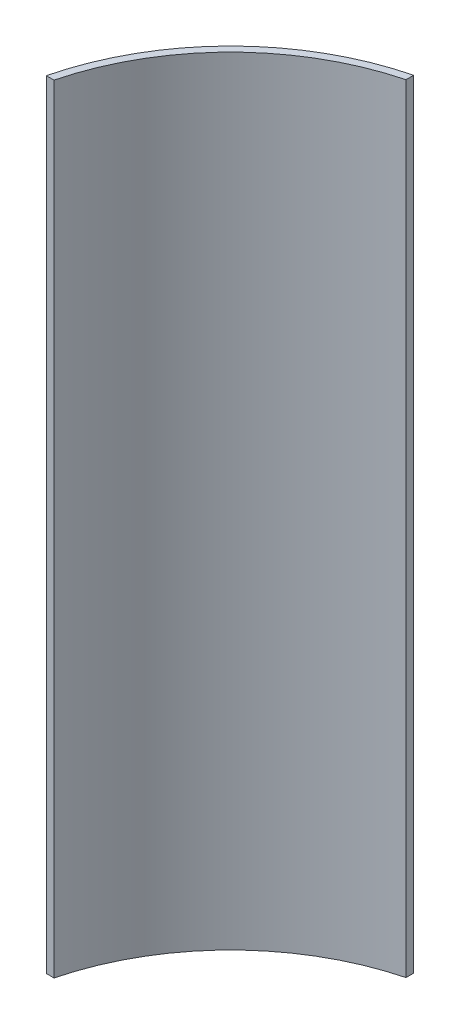
ISO-10303-21;
HEADER;
FILE_DESCRIPTION(('STEP AP214'),'2;1');
FILE_NAME('part.step','',(''),(''),'','','');
FILE_SCHEMA(('AUTOMOTIVE_DESIGN { 1 0 10303 214 1 1 1 1 }'));
ENDSEC;
DATA;
#1=APPLICATION_CONTEXT('core data for automotive mechanical design processes');
#2=APPLICATION_PROTOCOL_DEFINITION('international standard','automotive_design',2000,#1);
#3=PRODUCT_CONTEXT('',#1,'mechanical');
#4=PRODUCT('Part','Part','',(#3));
#5=PRODUCT_RELATED_PRODUCT_CATEGORY('part','',(#4));
#6=PRODUCT_DEFINITION_FORMATION('','',#4);
#7=PRODUCT_DEFINITION_CONTEXT('part definition',#1,'design');
#8=PRODUCT_DEFINITION('design','',#6,#7);
#9=PRODUCT_DEFINITION_SHAPE('','',#8);
#10=(LENGTH_UNIT() NAMED_UNIT(*) SI_UNIT(.MILLI.,.METRE.));
#11=(NAMED_UNIT(*) PLANE_ANGLE_UNIT() SI_UNIT($,.RADIAN.));
#12=(NAMED_UNIT(*) SI_UNIT($,.STERADIAN.) SOLID_ANGLE_UNIT());
#13=UNCERTAINTY_MEASURE_WITH_UNIT(LENGTH_MEASURE(1.E-05),#10,'distance_accuracy_value','');
#14=(GEOMETRIC_REPRESENTATION_CONTEXT(3) GLOBAL_UNCERTAINTY_ASSIGNED_CONTEXT((#13)) GLOBAL_UNIT_ASSIGNED_CONTEXT((#10,
#11,#12)) REPRESENTATION_CONTEXT('',''));
#15=CARTESIAN_POINT('',(0.,0.,0.));
#16=DIRECTION('',(0.,0.,1.));
#17=DIRECTION('',(1.,0.,0.));
#18=AXIS2_PLACEMENT_3D('',#15,#16,#17);
#19=CARTESIAN_POINT('',(0.,125.,0.));
#20=DIRECTION('',(0.,-1.,0.));
#21=DIRECTION('',(0.,0.,-1.));
#22=AXIS2_PLACEMENT_3D('',#19,#20,#21);
#23=CYLINDRICAL_SURFACE('',#22,40.5);
#24=CARTESIAN_POINT('',(0.,0.,0.));
#25=DIRECTION('',(0.,1.,0.));
#26=DIRECTION('',(0.,0.,1.));
#27=AXIS2_PLACEMENT_3D('',#24,#25,#26);
#28=CIRCLE('',#27,40.5);
#29=CARTESIAN_POINT('',(-9.85411742445923,0.,-39.2829017485339));
#30=VERTEX_POINT('',#29);
#31=CARTESIAN_POINT('',(-39.3212410790911,0.,-9.7));
#32=VERTEX_POINT('',#31);
#33=EDGE_CURVE('E96',#30,#32,#28,.T.);
#34=ORIENTED_EDGE('',*,*,#33,.T.);
#35=DIRECTION('',(0.,-1.,0.));
#36=VECTOR('',#35,1.);
#37=CARTESIAN_POINT('',(-39.3212410790911,125.,-9.7));
#38=LINE('',#37,#36);
#39=CARTESIAN_POINT('',(-39.3212410790911,125.,-9.7));
#40=VERTEX_POINT('',#39);
#41=EDGE_CURVE('E11',#40,#32,#38,.T.);
#42=ORIENTED_EDGE('',*,*,#41,.F.);
#43=CARTESIAN_POINT('',(0.,125.,0.));
#44=DIRECTION('',(0.,1.,0.));
#45=DIRECTION('',(0.,0.,1.));
#46=AXIS2_PLACEMENT_3D('',#43,#44,#45);
#47=CIRCLE('',#46,40.5);
#48=CARTESIAN_POINT('',(-9.85411742445923,125.,-39.2829017485339));
#49=VERTEX_POINT('',#48);
#50=EDGE_CURVE('E84',#49,#40,#47,.T.);
#51=ORIENTED_EDGE('',*,*,#50,.F.);
#52=DIRECTION('',(0.,-1.,0.));
#53=VECTOR('',#52,1.);
#54=CARTESIAN_POINT('',(-9.85411742445923,125.,-39.2829017485339));
#55=LINE('',#54,#53);
#56=EDGE_CURVE('E92',#49,#30,#55,.T.);
#57=ORIENTED_EDGE('',*,*,#56,.T.);
#58=EDGE_LOOP('',(#34,#42,#51,#57));
#59=FACE_BOUND('',#58,.T.);
#60=ADVANCED_FACE('F33',(#59),#23,.T.);
#61=CARTESIAN_POINT('',(-39.3212410790911,125.,-9.7));
#62=DIRECTION('',(0.,0.,-1.));
#63=DIRECTION('',(-1.,0.,0.));
#64=AXIS2_PLACEMENT_3D('',#61,#62,#63);
#65=PLANE('',#64);
#66=DIRECTION('',(1.,0.,0.));
#67=VECTOR('',#66,1.);
#68=CARTESIAN_POINT('',(-39.3212410790911,0.,-9.7));
#69=LINE('',#68,#67);
#70=CARTESIAN_POINT('',(-38.0841174244592,0.,-9.7));
#71=VERTEX_POINT('',#70);
#72=EDGE_CURVE('E88',#32,#71,#69,.T.);
#73=ORIENTED_EDGE('',*,*,#72,.T.);
#74=DIRECTION('',(0.,-1.,0.));
#75=VECTOR('',#74,1.);
#76=CARTESIAN_POINT('',(-38.0841174244592,125.,-9.7));
#77=LINE('',#76,#75);
#78=CARTESIAN_POINT('',(-38.0841174244592,125.,-9.7));
#79=VERTEX_POINT('',#78);
#80=EDGE_CURVE('E41',#79,#71,#77,.T.);
#81=ORIENTED_EDGE('',*,*,#80,.F.);
#82=DIRECTION('',(1.,0.,0.));
#83=VECTOR('',#82,1.);
#84=CARTESIAN_POINT('',(-39.3212410790911,125.,-9.7));
#85=LINE('',#84,#83);
#86=EDGE_CURVE('E79',#40,#79,#85,.T.);
#87=ORIENTED_EDGE('',*,*,#86,.F.);
#88=ORIENTED_EDGE('',*,*,#41,.T.);
#89=EDGE_LOOP('',(#73,#81,#87,#88));
#90=FACE_BOUND('',#89,.T.);
#91=ADVANCED_FACE('F87',(#90),#65,.F.);
#92=CARTESIAN_POINT('',(0.,125.,0.));
#93=DIRECTION('',(0.,-1.,0.));
#94=DIRECTION('',(0.,0.,-1.));
#95=AXIS2_PLACEMENT_3D('',#92,#93,#94);
#96=CYLINDRICAL_SURFACE('',#95,39.3);
#97=CARTESIAN_POINT('',(0.,0.,0.));
#98=DIRECTION('',(0.,-1.,0.));
#99=DIRECTION('',(0.,0.,1.));
#100=AXIS2_PLACEMENT_3D('',#97,#98,#99);
#101=CIRCLE('',#100,39.3);
#102=CARTESIAN_POINT('',(-9.85411742445923,0.,-38.0445314044603));
#103=VERTEX_POINT('',#102);
#104=EDGE_CURVE('E66',#71,#103,#101,.T.);
#105=ORIENTED_EDGE('',*,*,#104,.T.);
#106=DIRECTION('',(0.,-1.,0.));
#107=VECTOR('',#106,1.);
#108=CARTESIAN_POINT('',(-9.85411742445923,125.,-38.0445314044603));
#109=LINE('',#108,#107);
#110=CARTESIAN_POINT('',(-9.85411742445923,125.,-38.0445314044603));
#111=VERTEX_POINT('',#110);
#112=EDGE_CURVE('E89',#111,#103,#109,.T.);
#113=ORIENTED_EDGE('',*,*,#112,.F.);
#114=CARTESIAN_POINT('',(0.,125.,0.));
#115=DIRECTION('',(0.,-1.,0.));
#116=DIRECTION('',(0.,0.,1.));
#117=AXIS2_PLACEMENT_3D('',#114,#115,#116);
#118=CIRCLE('',#117,39.3);
#119=EDGE_CURVE('E82',#79,#111,#118,.T.);
#120=ORIENTED_EDGE('',*,*,#119,.F.);
#121=ORIENTED_EDGE('',*,*,#80,.T.);
#122=EDGE_LOOP('',(#105,#113,#120,#121));
#123=FACE_BOUND('',#122,.T.);
#124=ADVANCED_FACE('F90',(#123),#96,.F.);
#125=CARTESIAN_POINT('',(-9.85411742445923,125.,-38.0445314044603));
#126=DIRECTION('',(-1.,0.,0.));
#127=DIRECTION('',(0.,0.,1.));
#128=AXIS2_PLACEMENT_3D('',#125,#126,#127);
#129=PLANE('',#128);
#130=DIRECTION('',(0.,0.,-1.));
#131=VECTOR('',#130,1.);
#132=CARTESIAN_POINT('',(-9.85411742445923,0.,-38.0445314044603));
#133=LINE('',#132,#131);
#134=EDGE_CURVE('E72',#103,#30,#133,.T.);
#135=ORIENTED_EDGE('',*,*,#134,.T.);
#136=ORIENTED_EDGE('',*,*,#56,.F.);
#137=DIRECTION('',(0.,0.,-1.));
#138=VECTOR('',#137,1.);
#139=CARTESIAN_POINT('',(-9.85411742445923,125.,-38.0445314044603));
#140=LINE('',#139,#138);
#141=EDGE_CURVE('E49',#111,#49,#140,.T.);
#142=ORIENTED_EDGE('',*,*,#141,.F.);
#143=ORIENTED_EDGE('',*,*,#112,.T.);
#144=EDGE_LOOP('',(#135,#136,#142,#143));
#145=FACE_BOUND('',#144,.T.);
#146=ADVANCED_FACE('F103',(#145),#129,.F.);
#147=CARTESIAN_POINT('',(0.,125.,0.));
#148=DIRECTION('',(0.,1.,0.));
#149=DIRECTION('',(0.,0.,1.));
#150=AXIS2_PLACEMENT_3D('',#147,#148,#149);
#151=PLANE('',#150);
#152=ORIENTED_EDGE('',*,*,#50,.T.);
#153=ORIENTED_EDGE('',*,*,#86,.T.);
#154=ORIENTED_EDGE('',*,*,#119,.T.);
#155=ORIENTED_EDGE('',*,*,#141,.T.);
#156=EDGE_LOOP('',(#152,#153,#154,#155));
#157=FACE_BOUND('',#156,.T.);
#158=ADVANCED_FACE('F80',(#157),#151,.T.);
#159=CARTESIAN_POINT('',(0.,0.,0.));
#160=DIRECTION('',(0.,1.,0.));
#161=DIRECTION('',(0.,0.,1.));
#162=AXIS2_PLACEMENT_3D('',#159,#160,#161);
#163=PLANE('',#162);
#164=ORIENTED_EDGE('',*,*,#33,.F.);
#165=ORIENTED_EDGE('',*,*,#134,.F.);
#166=ORIENTED_EDGE('',*,*,#104,.F.);
#167=ORIENTED_EDGE('',*,*,#72,.F.);
#168=EDGE_LOOP('',(#164,#165,#166,#167));
#169=FACE_BOUND('',#168,.T.);
#170=ADVANCED_FACE('F106',(#169),#163,.F.);
#171=CLOSED_SHELL('',(#60,#91,#124,#146,#158,#170));
#172=MANIFOLD_SOLID_BREP('B2',#171);
#173=ADVANCED_BREP_SHAPE_REPRESENTATION('',(#18,#172),#14);
#174=SHAPE_DEFINITION_REPRESENTATION(#9,#173);
ENDSEC;
END-ISO-10303-21;
